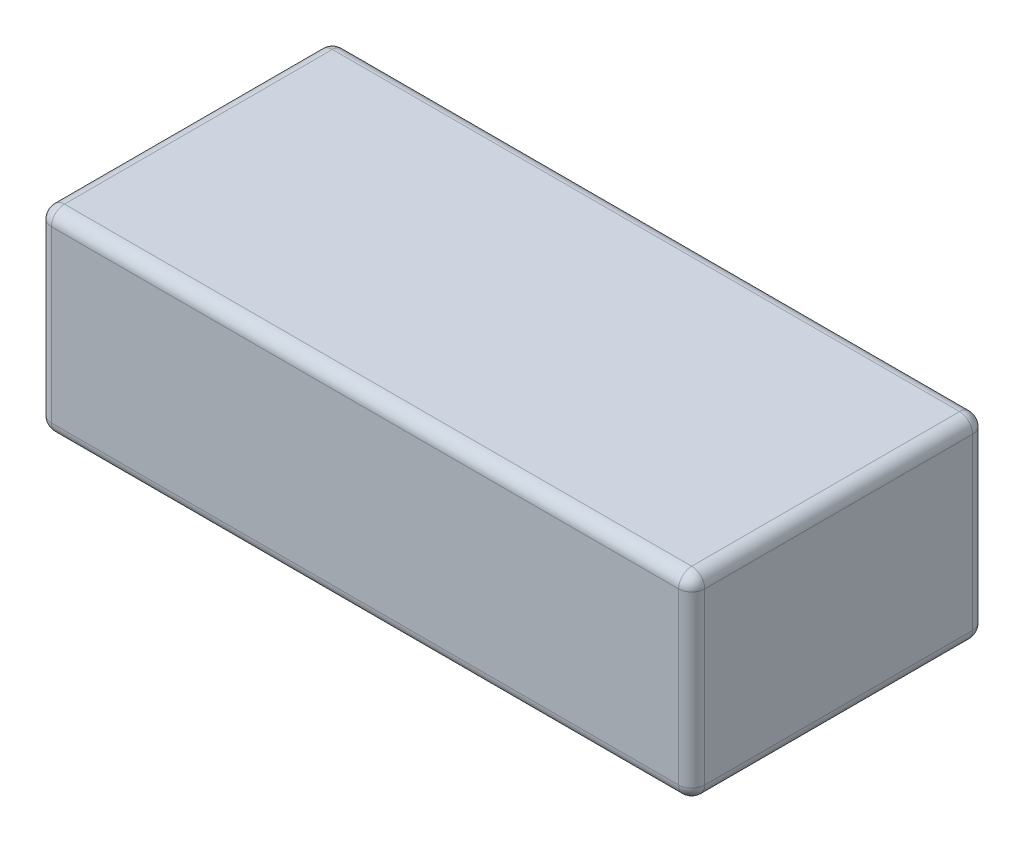
ISO-10303-21;
HEADER;
FILE_DESCRIPTION(('STEP AP214'),'2;1');
FILE_NAME('part.step','',(''),(''),'','','');
FILE_SCHEMA(('AUTOMOTIVE_DESIGN { 1 0 10303 214 1 1 1 1 }'));
ENDSEC;
DATA;
#1=APPLICATION_CONTEXT('core data for automotive mechanical design processes');
#2=APPLICATION_PROTOCOL_DEFINITION('international standard','automotive_design',2000,#1);
#3=PRODUCT_CONTEXT('',#1,'mechanical');
#4=PRODUCT('Part','Part','',(#3));
#5=PRODUCT_RELATED_PRODUCT_CATEGORY('part','',(#4));
#6=PRODUCT_DEFINITION_FORMATION('','',#4);
#7=PRODUCT_DEFINITION_CONTEXT('part definition',#1,'design');
#8=PRODUCT_DEFINITION('design','',#6,#7);
#9=PRODUCT_DEFINITION_SHAPE('','',#8);
#10=(LENGTH_UNIT() NAMED_UNIT(*) SI_UNIT(.MILLI.,.METRE.));
#11=(NAMED_UNIT(*) PLANE_ANGLE_UNIT() SI_UNIT($,.RADIAN.));
#12=(NAMED_UNIT(*) SI_UNIT($,.STERADIAN.) SOLID_ANGLE_UNIT());
#13=UNCERTAINTY_MEASURE_WITH_UNIT(LENGTH_MEASURE(1.E-05),#10,'distance_accuracy_value','');
#14=(GEOMETRIC_REPRESENTATION_CONTEXT(3) GLOBAL_UNCERTAINTY_ASSIGNED_CONTEXT((#13)) GLOBAL_UNIT_ASSIGNED_CONTEXT((#10,
#11,#12)) REPRESENTATION_CONTEXT('',''));
#15=CARTESIAN_POINT('',(0.,0.,0.));
#16=DIRECTION('',(0.,0.,1.));
#17=DIRECTION('',(1.,0.,0.));
#18=AXIS2_PLACEMENT_3D('',#15,#16,#17);
#19=CARTESIAN_POINT('',(0.,30.,0.));
#20=DIRECTION('',(1.,0.,0.));
#21=DIRECTION('',(0.,0.,-1.));
#22=AXIS2_PLACEMENT_3D('',#19,#20,#21);
#23=PLANE('',#22);
#24=DIRECTION('',(0.,-1.,0.));
#25=VECTOR('',#24,1.);
#26=CARTESIAN_POINT('',(0.,30.,-43.));
#27=LINE('',#26,#25);
#28=CARTESIAN_POINT('',(0.,28.,-43.));
#29=VERTEX_POINT('',#28);
#30=CARTESIAN_POINT('',(0.,2.,-43.));
#31=VERTEX_POINT('',#30);
#32=EDGE_CURVE('E175',#29,#31,#27,.T.);
#33=ORIENTED_EDGE('',*,*,#32,.T.);
#34=DIRECTION('',(0.,0.,1.));
#35=VECTOR('',#34,1.);
#36=CARTESIAN_POINT('',(0.,2.,0.));
#37=LINE('',#36,#35);
#38=CARTESIAN_POINT('',(0.,2.,-2.));
#39=VERTEX_POINT('',#38);
#40=EDGE_CURVE('E177',#31,#39,#37,.T.);
#41=ORIENTED_EDGE('',*,*,#40,.T.);
#42=DIRECTION('',(0.,-1.,0.));
#43=VECTOR('',#42,1.);
#44=CARTESIAN_POINT('',(0.,30.,-2.));
#45=LINE('',#44,#43);
#46=CARTESIAN_POINT('',(0.,28.,-2.));
#47=VERTEX_POINT('',#46);
#48=EDGE_CURVE('E171',#39,#47,#45,.F.);
#49=ORIENTED_EDGE('',*,*,#48,.T.);
#50=DIRECTION('',(0.,0.,1.));
#51=VECTOR('',#50,1.);
#52=CARTESIAN_POINT('',(0.,28.,0.));
#53=LINE('',#52,#51);
#54=EDGE_CURVE('E173',#47,#29,#53,.F.);
#55=ORIENTED_EDGE('',*,*,#54,.T.);
#56=EDGE_LOOP('',(#33,#41,#49,#55));
#57=FACE_BOUND('',#56,.T.);
#58=ADVANCED_FACE('F32',(#57),#23,.F.);
#59=CARTESIAN_POINT('',(0.,30.,0.));
#60=DIRECTION('',(0.,0.,-1.));
#61=DIRECTION('',(-1.,0.,0.));
#62=AXIS2_PLACEMENT_3D('',#59,#60,#61);
#63=PLANE('',#62);
#64=DIRECTION('',(1.,0.,0.));
#65=VECTOR('',#64,1.);
#66=CARTESIAN_POINT('',(0.,28.,0.));
#67=LINE('',#66,#65);
#68=CARTESIAN_POINT('',(98.,28.,0.));
#69=VERTEX_POINT('',#68);
#70=CARTESIAN_POINT('',(2.,28.,0.));
#71=VERTEX_POINT('',#70);
#72=EDGE_CURVE('E41',#69,#71,#67,.F.);
#73=ORIENTED_EDGE('',*,*,#72,.T.);
#74=DIRECTION('',(0.,-1.,0.));
#75=VECTOR('',#74,1.);
#76=CARTESIAN_POINT('',(2.,30.,0.));
#77=LINE('',#76,#75);
#78=CARTESIAN_POINT('',(2.,2.,0.));
#79=VERTEX_POINT('',#78);
#80=EDGE_CURVE('E11',#71,#79,#77,.T.);
#81=ORIENTED_EDGE('',*,*,#80,.T.);
#82=DIRECTION('',(1.,0.,0.));
#83=VECTOR('',#82,1.);
#84=CARTESIAN_POINT('',(100.,2.,0.));
#85=LINE('',#84,#83);
#86=CARTESIAN_POINT('',(98.,2.,0.));
#87=VERTEX_POINT('',#86);
#88=EDGE_CURVE('E197',#79,#87,#85,.T.);
#89=ORIENTED_EDGE('',*,*,#88,.T.);
#90=DIRECTION('',(0.,-1.,0.));
#91=VECTOR('',#90,1.);
#92=CARTESIAN_POINT('',(98.,30.,0.));
#93=LINE('',#92,#91);
#94=EDGE_CURVE('E52',#87,#69,#93,.F.);
#95=ORIENTED_EDGE('',*,*,#94,.T.);
#96=EDGE_LOOP('',(#73,#81,#89,#95));
#97=FACE_BOUND('',#96,.T.);
#98=ADVANCED_FACE('F309',(#97),#63,.F.);
#99=CARTESIAN_POINT('',(100.,30.,0.));
#100=DIRECTION('',(-1.,0.,0.));
#101=DIRECTION('',(0.,0.,1.));
#102=AXIS2_PLACEMENT_3D('',#99,#100,#101);
#103=PLANE('',#102);
#104=DIRECTION('',(0.,-1.,0.));
#105=VECTOR('',#104,1.);
#106=CARTESIAN_POINT('',(100.,30.,-2.));
#107=LINE('',#106,#105);
#108=CARTESIAN_POINT('',(100.,28.,-2.));
#109=VERTEX_POINT('',#108);
#110=CARTESIAN_POINT('',(100.,2.,-2.));
#111=VERTEX_POINT('',#110);
#112=EDGE_CURVE('E124',#109,#111,#107,.T.);
#113=ORIENTED_EDGE('',*,*,#112,.T.);
#114=DIRECTION('',(0.,0.,-1.));
#115=VECTOR('',#114,1.);
#116=CARTESIAN_POINT('',(100.,2.,-45.));
#117=LINE('',#116,#115);
#118=CARTESIAN_POINT('',(100.,2.,-43.));
#119=VERTEX_POINT('',#118);
#120=EDGE_CURVE('E160',#111,#119,#117,.T.);
#121=ORIENTED_EDGE('',*,*,#120,.T.);
#122=DIRECTION('',(0.,-1.,0.));
#123=VECTOR('',#122,1.);
#124=CARTESIAN_POINT('',(100.,30.,-43.));
#125=LINE('',#124,#123);
#126=CARTESIAN_POINT('',(100.,28.,-43.));
#127=VERTEX_POINT('',#126);
#128=EDGE_CURVE('E127',#119,#127,#125,.F.);
#129=ORIENTED_EDGE('',*,*,#128,.T.);
#130=DIRECTION('',(0.,0.,-1.));
#131=VECTOR('',#130,1.);
#132=CARTESIAN_POINT('',(100.,28.,0.));
#133=LINE('',#132,#131);
#134=EDGE_CURVE('E119',#127,#109,#133,.F.);
#135=ORIENTED_EDGE('',*,*,#134,.T.);
#136=EDGE_LOOP('',(#113,#121,#129,#135));
#137=FACE_BOUND('',#136,.T.);
#138=ADVANCED_FACE('F121',(#137),#103,.F.);
#139=CARTESIAN_POINT('',(0.,30.,-45.));
#140=DIRECTION('',(0.,0.,1.));
#141=DIRECTION('',(1.,0.,0.));
#142=AXIS2_PLACEMENT_3D('',#139,#140,#141);
#143=PLANE('',#142);
#144=DIRECTION('',(0.,-1.,0.));
#145=VECTOR('',#144,1.);
#146=CARTESIAN_POINT('',(98.,30.,-45.));
#147=LINE('',#146,#145);
#148=CARTESIAN_POINT('',(98.,28.,-45.));
#149=VERTEX_POINT('',#148);
#150=CARTESIAN_POINT('',(98.,2.,-45.));
#151=VERTEX_POINT('',#150);
#152=EDGE_CURVE('E184',#149,#151,#147,.T.);
#153=ORIENTED_EDGE('',*,*,#152,.T.);
#154=DIRECTION('',(-1.,0.,0.));
#155=VECTOR('',#154,1.);
#156=CARTESIAN_POINT('',(0.,2.,-45.));
#157=LINE('',#156,#155);
#158=CARTESIAN_POINT('',(2.,2.,-45.));
#159=VERTEX_POINT('',#158);
#160=EDGE_CURVE('E187',#151,#159,#157,.T.);
#161=ORIENTED_EDGE('',*,*,#160,.T.);
#162=DIRECTION('',(0.,-1.,0.));
#163=VECTOR('',#162,1.);
#164=CARTESIAN_POINT('',(2.,30.,-45.));
#165=LINE('',#164,#163);
#166=CARTESIAN_POINT('',(2.,28.,-45.));
#167=VERTEX_POINT('',#166);
#168=EDGE_CURVE('E182',#159,#167,#165,.F.);
#169=ORIENTED_EDGE('',*,*,#168,.T.);
#170=DIRECTION('',(-1.,0.,0.));
#171=VECTOR('',#170,1.);
#172=CARTESIAN_POINT('',(0.,28.,-45.));
#173=LINE('',#172,#171);
#174=EDGE_CURVE('E180',#167,#149,#173,.F.);
#175=ORIENTED_EDGE('',*,*,#174,.T.);
#176=EDGE_LOOP('',(#153,#161,#169,#175));
#177=FACE_BOUND('',#176,.T.);
#178=ADVANCED_FACE('F274',(#177),#143,.F.);
#179=CARTESIAN_POINT('',(0.,30.,0.));
#180=DIRECTION('',(0.,-1.,0.));
#181=DIRECTION('',(0.,0.,-1.));
#182=AXIS2_PLACEMENT_3D('',#179,#180,#181);
#183=PLANE('',#182);
#184=DIRECTION('',(0.,0.,-1.));
#185=VECTOR('',#184,1.);
#186=CARTESIAN_POINT('',(98.,30.,0.));
#187=LINE('',#186,#185);
#188=CARTESIAN_POINT('',(98.,30.,-2.));
#189=VERTEX_POINT('',#188);
#190=CARTESIAN_POINT('',(98.,30.,-43.));
#191=VERTEX_POINT('',#190);
#192=EDGE_CURVE('E137',#189,#191,#187,.T.);
#193=ORIENTED_EDGE('',*,*,#192,.T.);
#194=DIRECTION('',(-1.,0.,0.));
#195=VECTOR('',#194,1.);
#196=CARTESIAN_POINT('',(0.,30.,-43.));
#197=LINE('',#196,#195);
#198=CARTESIAN_POINT('',(2.,30.,-43.));
#199=VERTEX_POINT('',#198);
#200=EDGE_CURVE('E194',#191,#199,#197,.T.);
#201=ORIENTED_EDGE('',*,*,#200,.T.);
#202=DIRECTION('',(0.,0.,1.));
#203=VECTOR('',#202,1.);
#204=CARTESIAN_POINT('',(2.,30.,0.));
#205=LINE('',#204,#203);
#206=CARTESIAN_POINT('',(2.,30.,-2.));
#207=VERTEX_POINT('',#206);
#208=EDGE_CURVE('E191',#199,#207,#205,.T.);
#209=ORIENTED_EDGE('',*,*,#208,.T.);
#210=DIRECTION('',(1.,0.,0.));
#211=VECTOR('',#210,1.);
#212=CARTESIAN_POINT('',(0.,30.,-2.));
#213=LINE('',#212,#211);
#214=EDGE_CURVE('E189',#207,#189,#213,.T.);
#215=ORIENTED_EDGE('',*,*,#214,.T.);
#216=EDGE_LOOP('',(#193,#201,#209,#215));
#217=FACE_BOUND('',#216,.T.);
#218=ADVANCED_FACE('F261',(#217),#183,.F.);
#219=CARTESIAN_POINT('',(0.,0.,0.));
#220=DIRECTION('',(0.,-1.,0.));
#221=DIRECTION('',(0.,0.,-1.));
#222=AXIS2_PLACEMENT_3D('',#219,#220,#221);
#223=PLANE('',#222);
#224=DIRECTION('',(0.,0.,1.));
#225=VECTOR('',#224,1.);
#226=CARTESIAN_POINT('',(2.,0.,-45.));
#227=LINE('',#226,#225);
#228=CARTESIAN_POINT('',(2.,0.,-2.));
#229=VERTEX_POINT('',#228);
#230=CARTESIAN_POINT('',(2.,0.,-43.));
#231=VERTEX_POINT('',#230);
#232=EDGE_CURVE('E164',#229,#231,#227,.F.);
#233=ORIENTED_EDGE('',*,*,#232,.T.);
#234=DIRECTION('',(-1.,0.,0.));
#235=VECTOR('',#234,1.);
#236=CARTESIAN_POINT('',(100.,0.,-43.));
#237=LINE('',#236,#235);
#238=CARTESIAN_POINT('',(98.,0.,-43.));
#239=VERTEX_POINT('',#238);
#240=EDGE_CURVE('E169',#231,#239,#237,.F.);
#241=ORIENTED_EDGE('',*,*,#240,.T.);
#242=DIRECTION('',(0.,0.,-1.));
#243=VECTOR('',#242,1.);
#244=CARTESIAN_POINT('',(98.,0.,0.));
#245=LINE('',#244,#243);
#246=CARTESIAN_POINT('',(98.,0.,-2.));
#247=VERTEX_POINT('',#246);
#248=EDGE_CURVE('E166',#239,#247,#245,.F.);
#249=ORIENTED_EDGE('',*,*,#248,.T.);
#250=DIRECTION('',(1.,0.,0.));
#251=VECTOR('',#250,1.);
#252=CARTESIAN_POINT('',(0.,0.,-2.));
#253=LINE('',#252,#251);
#254=EDGE_CURVE('E162',#247,#229,#253,.F.);
#255=ORIENTED_EDGE('',*,*,#254,.T.);
#256=EDGE_LOOP('',(#233,#241,#249,#255));
#257=FACE_BOUND('',#256,.T.);
#258=ADVANCED_FACE('F475',(#257),#223,.T.);
#259=CARTESIAN_POINT('',(2.,28.,0.));
#260=DIRECTION('',(0.,0.,1.));
#261=DIRECTION('',(1.,0.,0.));
#262=AXIS2_PLACEMENT_3D('',#259,#260,#261);
#263=CYLINDRICAL_SURFACE('',#262,2.);
#264=CARTESIAN_POINT('',(2.,28.,-2.));
#265=DIRECTION('',(0.,0.,1.));
#266=DIRECTION('',(1.,0.,0.));
#267=AXIS2_PLACEMENT_3D('',#264,#265,#266);
#268=CIRCLE('',#267,2.);
#269=EDGE_CURVE('E36',#207,#47,#268,.T.);
#270=ORIENTED_EDGE('',*,*,#269,.F.);
#271=ORIENTED_EDGE('',*,*,#208,.F.);
#272=CARTESIAN_POINT('',(2.,28.,-43.));
#273=DIRECTION('',(0.,0.,-1.));
#274=DIRECTION('',(-1.,0.,0.));
#275=AXIS2_PLACEMENT_3D('',#272,#273,#274);
#276=CIRCLE('',#275,2.);
#277=EDGE_CURVE('E157',#29,#199,#276,.T.);
#278=ORIENTED_EDGE('',*,*,#277,.F.);
#279=ORIENTED_EDGE('',*,*,#54,.F.);
#280=EDGE_LOOP('',(#270,#271,#278,#279));
#281=FACE_BOUND('',#280,.T.);
#282=ADVANCED_FACE('F34',(#281),#263,.T.);
#283=CARTESIAN_POINT('',(2.,28.,-2.));
#284=DIRECTION('',(0.,0.,1.));
#285=DIRECTION('',(1.,0.,0.));
#286=AXIS2_PLACEMENT_3D('',#283,#284,#285);
#287=SPHERICAL_SURFACE('',#286,2.);
#288=CARTESIAN_POINT('',(2.,28.,-2.));
#289=DIRECTION('',(-1.,0.,0.));
#290=DIRECTION('',(0.,0.,1.));
#291=AXIS2_PLACEMENT_3D('',#288,#289,#290);
#292=CIRCLE('',#291,2.);
#293=EDGE_CURVE('E242',#207,#71,#292,.F.);
#294=ORIENTED_EDGE('',*,*,#293,.F.);
#295=ORIENTED_EDGE('',*,*,#269,.T.);
#296=CARTESIAN_POINT('',(2.,28.,-2.));
#297=DIRECTION('',(0.,1.,0.));
#298=DIRECTION('',(0.,0.,1.));
#299=AXIS2_PLACEMENT_3D('',#296,#297,#298);
#300=CIRCLE('',#299,2.);
#301=EDGE_CURVE('E244',#71,#47,#300,.F.);
#302=ORIENTED_EDGE('',*,*,#301,.F.);
#303=EDGE_LOOP('',(#294,#295,#302));
#304=FACE_BOUND('',#303,.T.);
#305=ADVANCED_FACE('F296',(#304),#287,.T.);
#306=CARTESIAN_POINT('',(2.,28.,-43.));
#307=DIRECTION('',(0.,0.,1.));
#308=DIRECTION('',(1.,0.,0.));
#309=AXIS2_PLACEMENT_3D('',#306,#307,#308);
#310=SPHERICAL_SURFACE('',#309,2.);
#311=CARTESIAN_POINT('',(2.,28.,-43.));
#312=DIRECTION('',(0.,1.,0.));
#313=DIRECTION('',(0.,0.,1.));
#314=AXIS2_PLACEMENT_3D('',#311,#312,#313);
#315=CIRCLE('',#314,2.);
#316=EDGE_CURVE('E237',#29,#167,#315,.F.);
#317=ORIENTED_EDGE('',*,*,#316,.F.);
#318=ORIENTED_EDGE('',*,*,#277,.T.);
#319=CARTESIAN_POINT('',(2.,28.,-43.));
#320=DIRECTION('',(-1.,0.,0.));
#321=DIRECTION('',(0.,0.,1.));
#322=AXIS2_PLACEMENT_3D('',#319,#320,#321);
#323=CIRCLE('',#322,2.);
#324=EDGE_CURVE('E240',#167,#199,#323,.F.);
#325=ORIENTED_EDGE('',*,*,#324,.F.);
#326=EDGE_LOOP('',(#317,#318,#325));
#327=FACE_BOUND('',#326,.T.);
#328=ADVANCED_FACE('F252',(#327),#310,.T.);
#329=CARTESIAN_POINT('',(2.,30.,-2.));
#330=DIRECTION('',(0.,-1.,0.));
#331=DIRECTION('',(0.,0.,-1.));
#332=AXIS2_PLACEMENT_3D('',#329,#330,#331);
#333=CYLINDRICAL_SURFACE('',#332,2.);
#334=ORIENTED_EDGE('',*,*,#301,.T.);
#335=ORIENTED_EDGE('',*,*,#48,.F.);
#336=CARTESIAN_POINT('',(2.,2.,-2.));
#337=DIRECTION('',(0.,-1.,0.));
#338=DIRECTION('',(0.,0.,-1.));
#339=AXIS2_PLACEMENT_3D('',#336,#337,#338);
#340=CIRCLE('',#339,2.);
#341=EDGE_CURVE('E232',#79,#39,#340,.T.);
#342=ORIENTED_EDGE('',*,*,#341,.F.);
#343=ORIENTED_EDGE('',*,*,#80,.F.);
#344=EDGE_LOOP('',(#334,#335,#342,#343));
#345=FACE_BOUND('',#344,.T.);
#346=ADVANCED_FACE('F292',(#345),#333,.T.);
#347=CARTESIAN_POINT('',(0.,28.,-2.));
#348=DIRECTION('',(1.,0.,0.));
#349=DIRECTION('',(0.,0.,-1.));
#350=AXIS2_PLACEMENT_3D('',#347,#348,#349);
#351=CYLINDRICAL_SURFACE('',#350,2.);
#352=ORIENTED_EDGE('',*,*,#293,.T.);
#353=ORIENTED_EDGE('',*,*,#72,.F.);
#354=CARTESIAN_POINT('',(98.,28.,-2.));
#355=DIRECTION('',(1.,0.,0.));
#356=DIRECTION('',(0.,0.,-1.));
#357=AXIS2_PLACEMENT_3D('',#354,#355,#356);
#358=CIRCLE('',#357,2.);
#359=EDGE_CURVE('E141',#189,#69,#358,.T.);
#360=ORIENTED_EDGE('',*,*,#359,.F.);
#361=ORIENTED_EDGE('',*,*,#214,.F.);
#362=EDGE_LOOP('',(#352,#353,#360,#361));
#363=FACE_BOUND('',#362,.T.);
#364=ADVANCED_FACE('F299',(#363),#351,.T.);
#365=CARTESIAN_POINT('',(98.,28.,0.));
#366=DIRECTION('',(0.,0.,-1.));
#367=DIRECTION('',(-1.,0.,0.));
#368=AXIS2_PLACEMENT_3D('',#365,#366,#367);
#369=CYLINDRICAL_SURFACE('',#368,2.);
#370=CARTESIAN_POINT('',(98.,28.,-43.));
#371=DIRECTION('',(0.,0.,-1.));
#372=DIRECTION('',(-1.,0.,0.));
#373=AXIS2_PLACEMENT_3D('',#370,#371,#372);
#374=CIRCLE('',#373,2.);
#375=EDGE_CURVE('E142',#191,#127,#374,.T.);
#376=ORIENTED_EDGE('',*,*,#375,.F.);
#377=ORIENTED_EDGE('',*,*,#192,.F.);
#378=CARTESIAN_POINT('',(98.,28.,-2.));
#379=DIRECTION('',(0.,0.,1.));
#380=DIRECTION('',(1.,0.,0.));
#381=AXIS2_PLACEMENT_3D('',#378,#379,#380);
#382=CIRCLE('',#381,2.);
#383=EDGE_CURVE('E134',#109,#189,#382,.T.);
#384=ORIENTED_EDGE('',*,*,#383,.F.);
#385=ORIENTED_EDGE('',*,*,#134,.F.);
#386=EDGE_LOOP('',(#376,#377,#384,#385));
#387=FACE_BOUND('',#386,.T.);
#388=ADVANCED_FACE('F136',(#387),#369,.T.);
#389=CARTESIAN_POINT('',(0.,28.,-43.));
#390=DIRECTION('',(-1.,0.,0.));
#391=DIRECTION('',(0.,0.,1.));
#392=AXIS2_PLACEMENT_3D('',#389,#390,#391);
#393=CYLINDRICAL_SURFACE('',#392,2.);
#394=ORIENTED_EDGE('',*,*,#324,.T.);
#395=ORIENTED_EDGE('',*,*,#200,.F.);
#396=CARTESIAN_POINT('',(98.,28.,-43.));
#397=DIRECTION('',(1.,0.,0.));
#398=DIRECTION('',(0.,0.,-1.));
#399=AXIS2_PLACEMENT_3D('',#396,#397,#398);
#400=CIRCLE('',#399,2.);
#401=EDGE_CURVE('E227',#149,#191,#400,.T.);
#402=ORIENTED_EDGE('',*,*,#401,.F.);
#403=ORIENTED_EDGE('',*,*,#174,.F.);
#404=EDGE_LOOP('',(#394,#395,#402,#403));
#405=FACE_BOUND('',#404,.T.);
#406=ADVANCED_FACE('F264',(#405),#393,.T.);
#407=CARTESIAN_POINT('',(2.,30.,-43.));
#408=DIRECTION('',(0.,-1.,0.));
#409=DIRECTION('',(0.,0.,-1.));
#410=AXIS2_PLACEMENT_3D('',#407,#408,#409);
#411=CYLINDRICAL_SURFACE('',#410,2.);
#412=ORIENTED_EDGE('',*,*,#316,.T.);
#413=ORIENTED_EDGE('',*,*,#168,.F.);
#414=CARTESIAN_POINT('',(2.,2.,-43.));
#415=DIRECTION('',(0.,-1.,0.));
#416=DIRECTION('',(0.,0.,-1.));
#417=AXIS2_PLACEMENT_3D('',#414,#415,#416);
#418=CIRCLE('',#417,2.);
#419=EDGE_CURVE('E224',#31,#159,#418,.T.);
#420=ORIENTED_EDGE('',*,*,#419,.F.);
#421=ORIENTED_EDGE('',*,*,#32,.F.);
#422=EDGE_LOOP('',(#412,#413,#420,#421));
#423=FACE_BOUND('',#422,.T.);
#424=ADVANCED_FACE('F278',(#423),#411,.T.);
#425=CARTESIAN_POINT('',(2.,2.,0.));
#426=DIRECTION('',(0.,0.,-1.));
#427=DIRECTION('',(-1.,0.,0.));
#428=AXIS2_PLACEMENT_3D('',#425,#426,#427);
#429=CYLINDRICAL_SURFACE('',#428,2.);
#430=CARTESIAN_POINT('',(2.,2.,-2.));
#431=DIRECTION('',(0.,0.,1.));
#432=DIRECTION('',(1.,0.,0.));
#433=AXIS2_PLACEMENT_3D('',#430,#431,#432);
#434=CIRCLE('',#433,2.);
#435=EDGE_CURVE('E234',#39,#229,#434,.T.);
#436=ORIENTED_EDGE('',*,*,#435,.F.);
#437=ORIENTED_EDGE('',*,*,#40,.F.);
#438=CARTESIAN_POINT('',(2.,2.,-43.));
#439=DIRECTION('',(0.,0.,-1.));
#440=DIRECTION('',(-1.,0.,0.));
#441=AXIS2_PLACEMENT_3D('',#438,#439,#440);
#442=CIRCLE('',#441,2.);
#443=EDGE_CURVE('E221',#231,#31,#442,.T.);
#444=ORIENTED_EDGE('',*,*,#443,.F.);
#445=ORIENTED_EDGE('',*,*,#232,.F.);
#446=EDGE_LOOP('',(#436,#437,#444,#445));
#447=FACE_BOUND('',#446,.T.);
#448=ADVANCED_FACE('F284',(#447),#429,.T.);
#449=CARTESIAN_POINT('',(2.,2.,-2.));
#450=DIRECTION('',(0.,0.,1.));
#451=DIRECTION('',(1.,0.,0.));
#452=AXIS2_PLACEMENT_3D('',#449,#450,#451);
#453=SPHERICAL_SURFACE('',#452,2.);
#454=ORIENTED_EDGE('',*,*,#341,.T.);
#455=ORIENTED_EDGE('',*,*,#435,.T.);
#456=CARTESIAN_POINT('',(2.,2.,-2.));
#457=DIRECTION('',(-1.,0.,0.));
#458=DIRECTION('',(0.,0.,1.));
#459=AXIS2_PLACEMENT_3D('',#456,#457,#458);
#460=CIRCLE('',#459,2.);
#461=EDGE_CURVE('E148',#79,#229,#460,.F.);
#462=ORIENTED_EDGE('',*,*,#461,.F.);
#463=EDGE_LOOP('',(#454,#455,#462));
#464=FACE_BOUND('',#463,.T.);
#465=ADVANCED_FACE('F349',(#464),#453,.T.);
#466=CARTESIAN_POINT('',(98.,28.,-2.));
#467=DIRECTION('',(0.,0.,1.));
#468=DIRECTION('',(1.,0.,0.));
#469=AXIS2_PLACEMENT_3D('',#466,#467,#468);
#470=SPHERICAL_SURFACE('',#469,2.);
#471=ORIENTED_EDGE('',*,*,#383,.T.);
#472=ORIENTED_EDGE('',*,*,#359,.T.);
#473=CARTESIAN_POINT('',(98.,28.,-2.));
#474=DIRECTION('',(0.,1.,0.));
#475=DIRECTION('',(0.,0.,1.));
#476=AXIS2_PLACEMENT_3D('',#473,#474,#475);
#477=CIRCLE('',#476,2.);
#478=EDGE_CURVE('E145',#109,#69,#477,.F.);
#479=ORIENTED_EDGE('',*,*,#478,.F.);
#480=EDGE_LOOP('',(#471,#472,#479));
#481=FACE_BOUND('',#480,.T.);
#482=ADVANCED_FACE('F146',(#481),#470,.T.);
#483=CARTESIAN_POINT('',(98.,28.,-43.));
#484=DIRECTION('',(0.,0.,1.));
#485=DIRECTION('',(1.,0.,0.));
#486=AXIS2_PLACEMENT_3D('',#483,#484,#485);
#487=SPHERICAL_SURFACE('',#486,2.);
#488=ORIENTED_EDGE('',*,*,#401,.T.);
#489=ORIENTED_EDGE('',*,*,#375,.T.);
#490=CARTESIAN_POINT('',(98.,28.,-43.));
#491=DIRECTION('',(0.,1.,0.));
#492=DIRECTION('',(0.,0.,1.));
#493=AXIS2_PLACEMENT_3D('',#490,#491,#492);
#494=CIRCLE('',#493,2.);
#495=EDGE_CURVE('E149',#149,#127,#494,.F.);
#496=ORIENTED_EDGE('',*,*,#495,.F.);
#497=EDGE_LOOP('',(#488,#489,#496));
#498=FACE_BOUND('',#497,.T.);
#499=ADVANCED_FACE('F267',(#498),#487,.T.);
#500=CARTESIAN_POINT('',(2.,2.,-43.));
#501=DIRECTION('',(0.,0.,1.));
#502=DIRECTION('',(1.,0.,0.));
#503=AXIS2_PLACEMENT_3D('',#500,#501,#502);
#504=SPHERICAL_SURFACE('',#503,2.);
#505=ORIENTED_EDGE('',*,*,#443,.T.);
#506=ORIENTED_EDGE('',*,*,#419,.T.);
#507=CARTESIAN_POINT('',(2.,2.,-43.));
#508=DIRECTION('',(-1.,0.,0.));
#509=DIRECTION('',(0.,0.,1.));
#510=AXIS2_PLACEMENT_3D('',#507,#508,#509);
#511=CIRCLE('',#510,2.);
#512=EDGE_CURVE('E214',#231,#159,#511,.F.);
#513=ORIENTED_EDGE('',*,*,#512,.F.);
#514=EDGE_LOOP('',(#505,#506,#513));
#515=FACE_BOUND('',#514,.T.);
#516=ADVANCED_FACE('F340',(#515),#504,.T.);
#517=CARTESIAN_POINT('',(0.,2.,-2.));
#518=DIRECTION('',(-1.,0.,0.));
#519=DIRECTION('',(0.,0.,1.));
#520=AXIS2_PLACEMENT_3D('',#517,#518,#519);
#521=CYLINDRICAL_SURFACE('',#520,2.);
#522=ORIENTED_EDGE('',*,*,#461,.T.);
#523=ORIENTED_EDGE('',*,*,#254,.F.);
#524=CARTESIAN_POINT('',(98.,2.,-2.));
#525=DIRECTION('',(1.,0.,0.));
#526=DIRECTION('',(0.,0.,-1.));
#527=AXIS2_PLACEMENT_3D('',#524,#525,#526);
#528=CIRCLE('',#527,2.);
#529=EDGE_CURVE('E211',#87,#247,#528,.T.);
#530=ORIENTED_EDGE('',*,*,#529,.F.);
#531=ORIENTED_EDGE('',*,*,#88,.F.);
#532=EDGE_LOOP('',(#522,#523,#530,#531));
#533=FACE_BOUND('',#532,.T.);
#534=ADVANCED_FACE('F337',(#533),#521,.T.);
#535=CARTESIAN_POINT('',(98.,30.,-2.));
#536=DIRECTION('',(0.,-1.,0.));
#537=DIRECTION('',(0.,0.,-1.));
#538=AXIS2_PLACEMENT_3D('',#535,#536,#537);
#539=CYLINDRICAL_SURFACE('',#538,2.);
#540=ORIENTED_EDGE('',*,*,#478,.T.);
#541=ORIENTED_EDGE('',*,*,#94,.F.);
#542=CARTESIAN_POINT('',(98.,2.,-2.));
#543=DIRECTION('',(0.,-1.,0.));
#544=DIRECTION('',(0.,0.,-1.));
#545=AXIS2_PLACEMENT_3D('',#542,#543,#544);
#546=CIRCLE('',#545,2.);
#547=EDGE_CURVE('E153',#111,#87,#546,.T.);
#548=ORIENTED_EDGE('',*,*,#547,.F.);
#549=ORIENTED_EDGE('',*,*,#112,.F.);
#550=EDGE_LOOP('',(#540,#541,#548,#549));
#551=FACE_BOUND('',#550,.T.);
#552=ADVANCED_FACE('F151',(#551),#539,.T.);
#553=CARTESIAN_POINT('',(98.,30.,-43.));
#554=DIRECTION('',(0.,-1.,0.));
#555=DIRECTION('',(0.,0.,-1.));
#556=AXIS2_PLACEMENT_3D('',#553,#554,#555);
#557=CYLINDRICAL_SURFACE('',#556,2.);
#558=ORIENTED_EDGE('',*,*,#495,.T.);
#559=ORIENTED_EDGE('',*,*,#128,.F.);
#560=CARTESIAN_POINT('',(98.,2.,-43.));
#561=DIRECTION('',(0.,-1.,0.));
#562=DIRECTION('',(0.,0.,-1.));
#563=AXIS2_PLACEMENT_3D('',#560,#561,#562);
#564=CIRCLE('',#563,2.);
#565=EDGE_CURVE('E207',#151,#119,#564,.T.);
#566=ORIENTED_EDGE('',*,*,#565,.F.);
#567=ORIENTED_EDGE('',*,*,#152,.F.);
#568=EDGE_LOOP('',(#558,#559,#566,#567));
#569=FACE_BOUND('',#568,.T.);
#570=ADVANCED_FACE('F271',(#569),#557,.T.);
#571=CARTESIAN_POINT('',(0.,2.,-43.));
#572=DIRECTION('',(1.,0.,0.));
#573=DIRECTION('',(0.,0.,-1.));
#574=AXIS2_PLACEMENT_3D('',#571,#572,#573);
#575=CYLINDRICAL_SURFACE('',#574,2.);
#576=ORIENTED_EDGE('',*,*,#512,.T.);
#577=ORIENTED_EDGE('',*,*,#160,.F.);
#578=CARTESIAN_POINT('',(98.,2.,-43.));
#579=DIRECTION('',(1.,0.,0.));
#580=DIRECTION('',(0.,0.,-1.));
#581=AXIS2_PLACEMENT_3D('',#578,#579,#580);
#582=CIRCLE('',#581,2.);
#583=EDGE_CURVE('E205',#239,#151,#582,.T.);
#584=ORIENTED_EDGE('',*,*,#583,.F.);
#585=ORIENTED_EDGE('',*,*,#240,.F.);
#586=EDGE_LOOP('',(#576,#577,#584,#585));
#587=FACE_BOUND('',#586,.T.);
#588=ADVANCED_FACE('F328',(#587),#575,.T.);
#589=CARTESIAN_POINT('',(98.,2.,-2.));
#590=DIRECTION('',(0.,0.,1.));
#591=DIRECTION('',(1.,0.,0.));
#592=AXIS2_PLACEMENT_3D('',#589,#590,#591);
#593=SPHERICAL_SURFACE('',#592,2.);
#594=ORIENTED_EDGE('',*,*,#547,.T.);
#595=ORIENTED_EDGE('',*,*,#529,.T.);
#596=CARTESIAN_POINT('',(98.,2.,-2.));
#597=DIRECTION('',(0.,0.,1.));
#598=DIRECTION('',(1.,0.,0.));
#599=AXIS2_PLACEMENT_3D('',#596,#597,#598);
#600=CIRCLE('',#599,2.);
#601=EDGE_CURVE('E203',#111,#247,#600,.F.);
#602=ORIENTED_EDGE('',*,*,#601,.F.);
#603=EDGE_LOOP('',(#594,#595,#602));
#604=FACE_BOUND('',#603,.T.);
#605=ADVANCED_FACE('F324',(#604),#593,.T.);
#606=CARTESIAN_POINT('',(98.,2.,-43.));
#607=DIRECTION('',(0.,0.,1.));
#608=DIRECTION('',(1.,0.,0.));
#609=AXIS2_PLACEMENT_3D('',#606,#607,#608);
#610=SPHERICAL_SURFACE('',#609,2.);
#611=ORIENTED_EDGE('',*,*,#583,.T.);
#612=ORIENTED_EDGE('',*,*,#565,.T.);
#613=CARTESIAN_POINT('',(98.,2.,-43.));
#614=DIRECTION('',(0.,0.,-1.));
#615=DIRECTION('',(-1.,0.,0.));
#616=AXIS2_PLACEMENT_3D('',#613,#614,#615);
#617=CIRCLE('',#616,2.);
#618=EDGE_CURVE('E201',#239,#119,#617,.F.);
#619=ORIENTED_EDGE('',*,*,#618,.F.);
#620=EDGE_LOOP('',(#611,#612,#619));
#621=FACE_BOUND('',#620,.T.);
#622=ADVANCED_FACE('F320',(#621),#610,.T.);
#623=CARTESIAN_POINT('',(98.,2.,0.));
#624=DIRECTION('',(0.,0.,1.));
#625=DIRECTION('',(1.,0.,0.));
#626=AXIS2_PLACEMENT_3D('',#623,#624,#625);
#627=CYLINDRICAL_SURFACE('',#626,2.);
#628=ORIENTED_EDGE('',*,*,#601,.T.);
#629=ORIENTED_EDGE('',*,*,#248,.F.);
#630=ORIENTED_EDGE('',*,*,#618,.T.);
#631=ORIENTED_EDGE('',*,*,#120,.F.);
#632=EDGE_LOOP('',(#628,#629,#630,#631));
#633=FACE_BOUND('',#632,.T.);
#634=ADVANCED_FACE('F317',(#633),#627,.T.);
#635=CLOSED_SHELL('',(#58,#98,#138,#178,#218,#258,#282,#305,#328,#346,#364,#388,#406,#424,#448,
#465,#482,#499,#516,#534,#552,#570,#588,#605,#622,#634));
#636=MANIFOLD_SOLID_BREP('B2',#635);
#637=ADVANCED_BREP_SHAPE_REPRESENTATION('',(#18,#636),#14);
#638=SHAPE_DEFINITION_REPRESENTATION(#9,#637);
ENDSEC;
END-ISO-10303-21;
